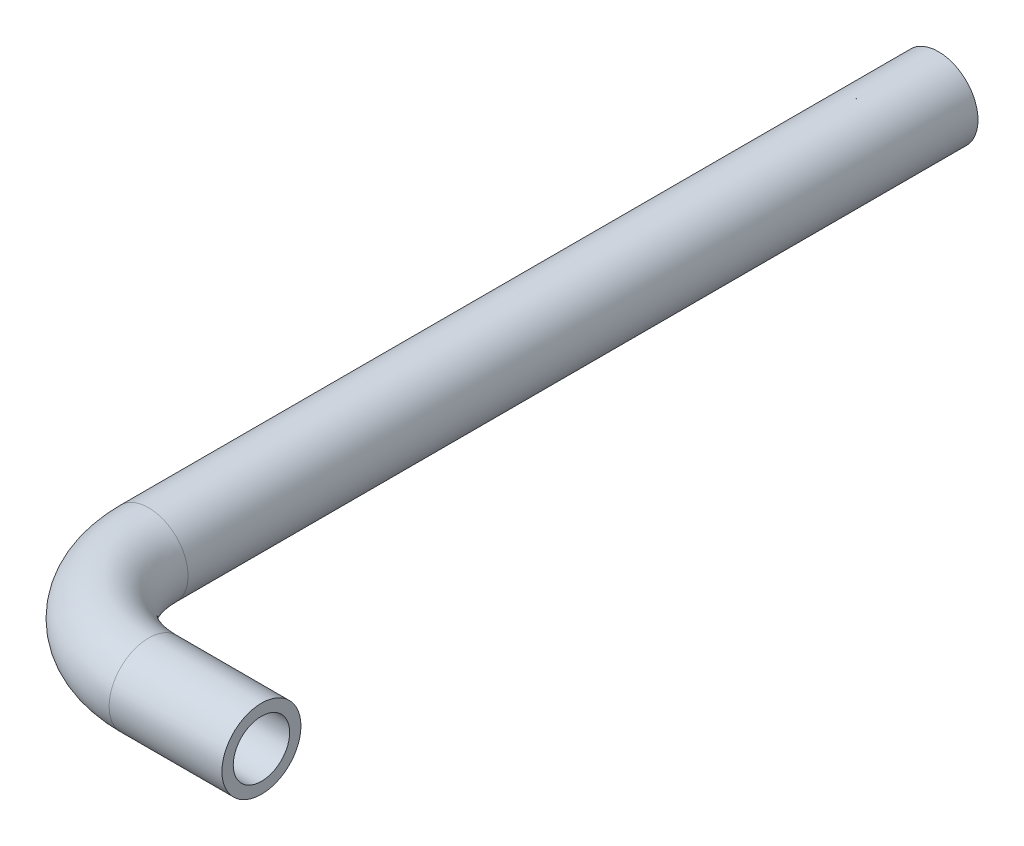
ISO-10303-21;
HEADER;
FILE_DESCRIPTION(('STEP AP214'),'2;1');
FILE_NAME('part.step','',(''),(''),'','','');
FILE_SCHEMA(('AUTOMOTIVE_DESIGN { 1 0 10303 214 1 1 1 1 }'));
ENDSEC;
DATA;
#1=APPLICATION_CONTEXT('core data for automotive mechanical design processes');
#2=APPLICATION_PROTOCOL_DEFINITION('international standard','automotive_design',2000,#1);
#3=PRODUCT_CONTEXT('',#1,'mechanical');
#4=PRODUCT('Part','Part','',(#3));
#5=PRODUCT_RELATED_PRODUCT_CATEGORY('part','',(#4));
#6=PRODUCT_DEFINITION_FORMATION('','',#4);
#7=PRODUCT_DEFINITION_CONTEXT('part definition',#1,'design');
#8=PRODUCT_DEFINITION('design','',#6,#7);
#9=PRODUCT_DEFINITION_SHAPE('','',#8);
#10=(LENGTH_UNIT() NAMED_UNIT(*) SI_UNIT(.MILLI.,.METRE.));
#11=(NAMED_UNIT(*) PLANE_ANGLE_UNIT() SI_UNIT($,.RADIAN.));
#12=(NAMED_UNIT(*) SI_UNIT($,.STERADIAN.) SOLID_ANGLE_UNIT());
#13=UNCERTAINTY_MEASURE_WITH_UNIT(LENGTH_MEASURE(1.E-05),#10,'distance_accuracy_value','');
#14=(GEOMETRIC_REPRESENTATION_CONTEXT(3) GLOBAL_UNCERTAINTY_ASSIGNED_CONTEXT((#13)) GLOBAL_UNIT_ASSIGNED_CONTEXT((#10,
#11,#12)) REPRESENTATION_CONTEXT('',''));
#15=CARTESIAN_POINT('',(0.,0.,0.));
#16=DIRECTION('',(0.,0.,1.));
#17=DIRECTION('',(1.,0.,0.));
#18=AXIS2_PLACEMENT_3D('',#15,#16,#17);
#19=CARTESIAN_POINT('',(0.,0.,0.));
#20=DIRECTION('',(-1.,0.,0.));
#21=DIRECTION('',(0.,0.,1.));
#22=AXIS2_PLACEMENT_3D('',#19,#20,#21);
#23=CYLINDRICAL_SURFACE('',#22,17.5);
#24=CARTESIAN_POINT('',(-450.,0.,0.));
#25=DIRECTION('',(1.,0.,0.));
#26=DIRECTION('',(0.,0.,-1.));
#27=AXIS2_PLACEMENT_3D('',#24,#25,#26);
#28=CIRCLE('',#27,17.5);
#29=CARTESIAN_POINT('',(-450.,0.,17.5000000000001));
#30=VERTEX_POINT('',#29);
#31=EDGE_CURVE('E50',#30,#30,#28,.T.);
#32=ORIENTED_EDGE('',*,*,#31,.T.);
#33=EDGE_LOOP('',(#32));
#34=FACE_BOUND('',#33,.T.);
#35=CARTESIAN_POINT('',(-400.,0.,0.));
#36=DIRECTION('',(1.,0.,0.));
#37=DIRECTION('',(0.,0.,-1.));
#38=AXIS2_PLACEMENT_3D('',#35,#36,#37);
#39=CIRCLE('',#38,17.5);
#40=CARTESIAN_POINT('',(-400.,0.,-17.5));
#41=VERTEX_POINT('',#40);
#42=EDGE_CURVE('E52',#41,#41,#39,.T.);
#43=ORIENTED_EDGE('',*,*,#42,.F.);
#44=EDGE_LOOP('',(#43));
#45=FACE_BOUND('',#44,.T.);
#46=ADVANCED_FACE('F31',(#34,#45),#23,.T.);
#47=CARTESIAN_POINT('',(0.,0.,0.));
#48=DIRECTION('',(-1.,0.,0.));
#49=DIRECTION('',(0.,0.,1.));
#50=AXIS2_PLACEMENT_3D('',#47,#48,#49);
#51=CYLINDRICAL_SURFACE('',#50,12.5);
#52=CARTESIAN_POINT('',(-450.,0.,0.));
#53=DIRECTION('',(1.,0.,0.));
#54=DIRECTION('',(0.,0.,-1.));
#55=AXIS2_PLACEMENT_3D('',#52,#53,#54);
#56=CIRCLE('',#55,12.5);
#57=CARTESIAN_POINT('',(-450.,0.,12.5000000000001));
#58=VERTEX_POINT('',#57);
#59=EDGE_CURVE('E44',#58,#58,#56,.F.);
#60=ORIENTED_EDGE('',*,*,#59,.T.);
#61=EDGE_LOOP('',(#60));
#62=FACE_BOUND('',#61,.T.);
#63=CARTESIAN_POINT('',(-400.,0.,0.));
#64=DIRECTION('',(1.,0.,0.));
#65=DIRECTION('',(0.,0.,-1.));
#66=AXIS2_PLACEMENT_3D('',#63,#64,#65);
#67=CIRCLE('',#66,12.5);
#68=CARTESIAN_POINT('',(-400.,0.,-12.5));
#69=VERTEX_POINT('',#68);
#70=EDGE_CURVE('E57',#69,#69,#67,.T.);
#71=ORIENTED_EDGE('',*,*,#70,.T.);
#72=EDGE_LOOP('',(#71));
#73=FACE_BOUND('',#72,.T.);
#74=ADVANCED_FACE('F66',(#62,#73),#51,.F.);
#75=CARTESIAN_POINT('',(-450.,0.,-50.));
#76=DIRECTION('',(0.,-1.,0.));
#77=DIRECTION('',(0.,0.,-1.));
#78=AXIS2_PLACEMENT_3D('',#75,#76,#77);
#79=TOROIDAL_SURFACE('',#78,50.,17.5);
#80=CARTESIAN_POINT('',(-500.,0.,-49.9999999999999));
#81=DIRECTION('',(0.,0.,1.));
#82=DIRECTION('',(1.,0.,0.));
#83=AXIS2_PLACEMENT_3D('',#80,#81,#82);
#84=CIRCLE('',#83,17.5);
#85=CARTESIAN_POINT('',(-517.5,0.,-49.9999999999999));
#86=VERTEX_POINT('',#85);
#87=EDGE_CURVE('E35',#86,#86,#84,.T.);
#88=CARTESIAN_POINT('',(-450.,0.,-50.));
#89=DIRECTION('',(0.,-1.,0.));
#90=DIRECTION('',(0.,0.,-1.));
#91=AXIS2_PLACEMENT_3D('',#88,#89,#90);
#92=CIRCLE('',#91,67.5);
#93=EDGE_CURVE('',#30,#86,#92,.T.);
#94=ORIENTED_EDGE('',*,*,#31,.F.);
#95=ORIENTED_EDGE('',*,*,#87,.T.);
#96=ORIENTED_EDGE('',*,*,#93,.T.);
#97=ORIENTED_EDGE('',*,*,#93,.F.);
#98=EDGE_LOOP('',(#94,#96,#95,#97));
#99=FACE_BOUND('',#98,.T.);
#100=ADVANCED_FACE('F89',(#99),#79,.T.);
#101=CARTESIAN_POINT('',(-500.,0.,-49.9999999999999));
#102=DIRECTION('',(0.,0.,-1.));
#103=DIRECTION('',(-1.,0.,0.));
#104=AXIS2_PLACEMENT_3D('',#101,#102,#103);
#105=CYLINDRICAL_SURFACE('',#104,17.5);
#106=CARTESIAN_POINT('',(-500.,0.,-400.));
#107=DIRECTION('',(0.,0.,1.));
#108=DIRECTION('',(1.,0.,0.));
#109=AXIS2_PLACEMENT_3D('',#106,#107,#108);
#110=CIRCLE('',#109,17.5);
#111=CARTESIAN_POINT('',(-482.5,0.,-400.));
#112=VERTEX_POINT('',#111);
#113=EDGE_CURVE('E48',#112,#112,#110,.T.);
#114=ORIENTED_EDGE('',*,*,#113,.T.);
#115=EDGE_LOOP('',(#114));
#116=FACE_BOUND('',#115,.T.);
#117=ORIENTED_EDGE('',*,*,#87,.F.);
#118=EDGE_LOOP('',(#117));
#119=FACE_BOUND('',#118,.T.);
#120=ADVANCED_FACE('F33',(#116,#119),#105,.T.);
#121=CARTESIAN_POINT('',(-500.,0.,-400.));
#122=DIRECTION('',(0.,0.,1.));
#123=DIRECTION('',(1.,0.,0.));
#124=AXIS2_PLACEMENT_3D('',#121,#122,#123);
#125=PLANE('',#124);
#126=CARTESIAN_POINT('',(-500.,0.,-400.));
#127=DIRECTION('',(0.,0.,1.));
#128=DIRECTION('',(1.,0.,0.));
#129=AXIS2_PLACEMENT_3D('',#126,#127,#128);
#130=CIRCLE('',#129,12.5);
#131=CARTESIAN_POINT('',(-487.5,0.,-400.));
#132=VERTEX_POINT('',#131);
#133=EDGE_CURVE('E10',#132,#132,#130,.F.);
#134=ORIENTED_EDGE('',*,*,#133,.F.);
#135=EDGE_LOOP('',(#134));
#136=FACE_BOUND('',#135,.T.);
#137=ORIENTED_EDGE('',*,*,#113,.F.);
#138=EDGE_LOOP('',(#137));
#139=FACE_BOUND('',#138,.T.);
#140=ADVANCED_FACE('F72',(#136,#139),#125,.F.);
#141=CARTESIAN_POINT('',(-450.,0.,-50.));
#142=DIRECTION('',(0.,-1.,0.));
#143=DIRECTION('',(0.,0.,-1.));
#144=AXIS2_PLACEMENT_3D('',#141,#142,#143);
#145=TOROIDAL_SURFACE('',#144,50.,12.5);
#146=CARTESIAN_POINT('',(-500.,0.,-49.9999999999999));
#147=DIRECTION('',(0.,0.,1.));
#148=DIRECTION('',(1.,0.,0.));
#149=AXIS2_PLACEMENT_3D('',#146,#147,#148);
#150=CIRCLE('',#149,12.5);
#151=CARTESIAN_POINT('',(-512.5,0.,-49.9999999999999));
#152=VERTEX_POINT('',#151);
#153=EDGE_CURVE('E39',#152,#152,#150,.F.);
#154=CARTESIAN_POINT('',(-450.,0.,-50.));
#155=DIRECTION('',(0.,-1.,0.));
#156=DIRECTION('',(0.,0.,-1.));
#157=AXIS2_PLACEMENT_3D('',#154,#155,#156);
#158=CIRCLE('',#157,62.5);
#159=EDGE_CURVE('',#58,#152,#158,.T.);
#160=ORIENTED_EDGE('',*,*,#59,.F.);
#161=ORIENTED_EDGE('',*,*,#153,.T.);
#162=ORIENTED_EDGE('',*,*,#159,.T.);
#163=ORIENTED_EDGE('',*,*,#159,.F.);
#164=EDGE_LOOP('',(#160,#162,#161,#163));
#165=FACE_BOUND('',#164,.T.);
#166=ADVANCED_FACE('F69',(#165),#145,.F.);
#167=CARTESIAN_POINT('',(-500.,0.,-49.9999999999999));
#168=DIRECTION('',(0.,0.,-1.));
#169=DIRECTION('',(-1.,0.,0.));
#170=AXIS2_PLACEMENT_3D('',#167,#168,#169);
#171=CYLINDRICAL_SURFACE('',#170,12.5);
#172=ORIENTED_EDGE('',*,*,#133,.T.);
#173=EDGE_LOOP('',(#172));
#174=FACE_BOUND('',#173,.T.);
#175=ORIENTED_EDGE('',*,*,#153,.F.);
#176=EDGE_LOOP('',(#175));
#177=FACE_BOUND('',#176,.T.);
#178=ADVANCED_FACE('F71',(#174,#177),#171,.F.);
#179=CARTESIAN_POINT('',(-400.,0.,0.));
#180=DIRECTION('',(1.,0.,0.));
#181=DIRECTION('',(0.,0.,-1.));
#182=AXIS2_PLACEMENT_3D('',#179,#180,#181);
#183=PLANE('',#182);
#184=ORIENTED_EDGE('',*,*,#70,.F.);
#185=EDGE_LOOP('',(#184));
#186=FACE_BOUND('',#185,.T.);
#187=ORIENTED_EDGE('',*,*,#42,.T.);
#188=EDGE_LOOP('',(#187));
#189=FACE_BOUND('',#188,.T.);
#190=ADVANCED_FACE('F79',(#186,#189),#183,.T.);
#191=CLOSED_SHELL('',(#46,#74,#100,#120,#140,#166,#178,#190));
#192=MANIFOLD_SOLID_BREP('B2',#191);
#193=ADVANCED_BREP_SHAPE_REPRESENTATION('',(#18,#192),#14);
#194=SHAPE_DEFINITION_REPRESENTATION(#9,#193);
ENDSEC;
END-ISO-10303-21;
